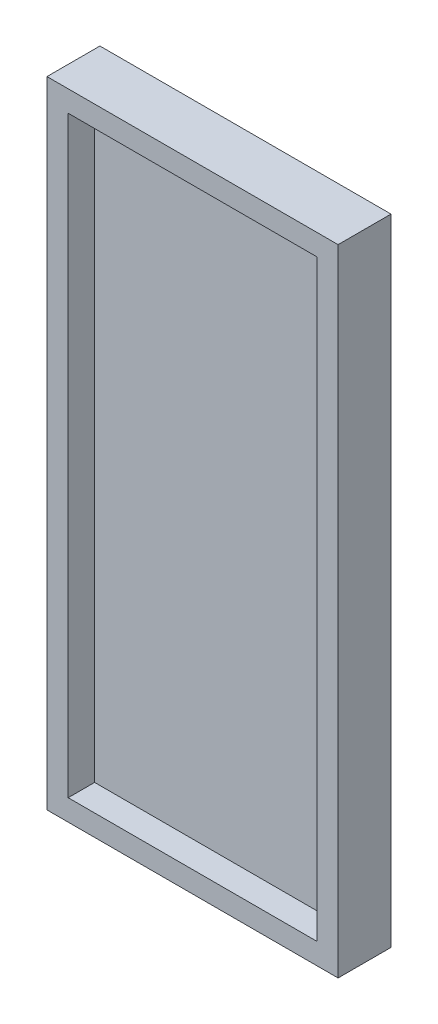
ISO-10303-21;
HEADER;
FILE_DESCRIPTION(('STEP AP214'),'2;1');
FILE_NAME('part.step','',(''),(''),'','','');
FILE_SCHEMA(('AUTOMOTIVE_DESIGN { 1 0 10303 214 1 1 1 1 }'));
ENDSEC;
DATA;
#1=APPLICATION_CONTEXT('core data for automotive mechanical design processes');
#2=APPLICATION_PROTOCOL_DEFINITION('international standard','automotive_design',2000,#1);
#3=PRODUCT_CONTEXT('',#1,'mechanical');
#4=PRODUCT('Part','Part','',(#3));
#5=PRODUCT_RELATED_PRODUCT_CATEGORY('part','',(#4));
#6=PRODUCT_DEFINITION_FORMATION('','',#4);
#7=PRODUCT_DEFINITION_CONTEXT('part definition',#1,'design');
#8=PRODUCT_DEFINITION('design','',#6,#7);
#9=PRODUCT_DEFINITION_SHAPE('','',#8);
#10=(LENGTH_UNIT() NAMED_UNIT(*) SI_UNIT(.MILLI.,.METRE.));
#11=(NAMED_UNIT(*) PLANE_ANGLE_UNIT() SI_UNIT($,.RADIAN.));
#12=(NAMED_UNIT(*) SI_UNIT($,.STERADIAN.) SOLID_ANGLE_UNIT());
#13=UNCERTAINTY_MEASURE_WITH_UNIT(LENGTH_MEASURE(1.E-05),#10,'distance_accuracy_value','');
#14=(GEOMETRIC_REPRESENTATION_CONTEXT(3) GLOBAL_UNCERTAINTY_ASSIGNED_CONTEXT((#13)) GLOBAL_UNIT_ASSIGNED_CONTEXT((#10,
#11,#12)) REPRESENTATION_CONTEXT('',''));
#15=CARTESIAN_POINT('',(0.,0.,0.));
#16=DIRECTION('',(0.,0.,1.));
#17=DIRECTION('',(1.,0.,0.));
#18=AXIS2_PLACEMENT_3D('',#15,#16,#17);
#19=CARTESIAN_POINT('',(0.,0.,10.));
#20=DIRECTION('',(0.,1.,0.));
#21=DIRECTION('',(0.,0.,1.));
#22=AXIS2_PLACEMENT_3D('',#19,#20,#21);
#23=PLANE('',#22);
#24=DIRECTION('',(1.,0.,0.));
#25=VECTOR('',#24,1.);
#26=CARTESIAN_POINT('',(0.,0.,0.));
#27=LINE('',#26,#25);
#28=CARTESIAN_POINT('',(-55.,0.,0.));
#29=VERTEX_POINT('',#28);
#30=CARTESIAN_POINT('',(0.,0.,0.));
#31=VERTEX_POINT('',#30);
#32=EDGE_CURVE('E164',#29,#31,#27,.T.);
#33=ORIENTED_EDGE('',*,*,#32,.T.);
#34=DIRECTION('',(0.,0.,-1.));
#35=VECTOR('',#34,1.);
#36=CARTESIAN_POINT('',(0.,0.,10.));
#37=LINE('',#36,#35);
#38=CARTESIAN_POINT('',(0.,0.,10.));
#39=VERTEX_POINT('',#38);
#40=EDGE_CURVE('E11',#39,#31,#37,.T.);
#41=ORIENTED_EDGE('',*,*,#40,.F.);
#42=DIRECTION('',(1.,0.,0.));
#43=VECTOR('',#42,1.);
#44=CARTESIAN_POINT('',(0.,0.,10.));
#45=LINE('',#44,#43);
#46=CARTESIAN_POINT('',(-55.,0.,10.));
#47=VERTEX_POINT('',#46);
#48=EDGE_CURVE('E170',#47,#39,#45,.T.);
#49=ORIENTED_EDGE('',*,*,#48,.F.);
#50=DIRECTION('',(0.,0.,-1.));
#51=VECTOR('',#50,1.);
#52=CARTESIAN_POINT('',(-55.,0.,10.));
#53=LINE('',#52,#51);
#54=EDGE_CURVE('E180',#47,#29,#53,.T.);
#55=ORIENTED_EDGE('',*,*,#54,.T.);
#56=EDGE_LOOP('',(#33,#41,#49,#55));
#57=FACE_BOUND('',#56,.T.);
#58=ADVANCED_FACE('F45',(#57),#23,.F.);
#59=CARTESIAN_POINT('',(0.,0.,10.));
#60=DIRECTION('',(-1.,0.,0.));
#61=DIRECTION('',(0.,0.,1.));
#62=AXIS2_PLACEMENT_3D('',#59,#60,#61);
#63=PLANE('',#62);
#64=DIRECTION('',(0.,1.,0.));
#65=VECTOR('',#64,1.);
#66=CARTESIAN_POINT('',(0.,0.,0.));
#67=LINE('',#66,#65);
#68=CARTESIAN_POINT('',(0.,120.,0.));
#69=VERTEX_POINT('',#68);
#70=EDGE_CURVE('E184',#31,#69,#67,.T.);
#71=ORIENTED_EDGE('',*,*,#70,.T.);
#72=DIRECTION('',(0.,0.,-1.));
#73=VECTOR('',#72,1.);
#74=CARTESIAN_POINT('',(0.,120.,10.));
#75=LINE('',#74,#73);
#76=CARTESIAN_POINT('',(0.,120.,10.));
#77=VERTEX_POINT('',#76);
#78=EDGE_CURVE('E53',#77,#69,#75,.T.);
#79=ORIENTED_EDGE('',*,*,#78,.F.);
#80=DIRECTION('',(0.,1.,0.));
#81=VECTOR('',#80,1.);
#82=CARTESIAN_POINT('',(0.,0.,10.));
#83=LINE('',#82,#81);
#84=EDGE_CURVE('E97',#39,#77,#83,.T.);
#85=ORIENTED_EDGE('',*,*,#84,.F.);
#86=ORIENTED_EDGE('',*,*,#40,.T.);
#87=EDGE_LOOP('',(#71,#79,#85,#86));
#88=FACE_BOUND('',#87,.T.);
#89=ADVANCED_FACE('F220',(#88),#63,.F.);
#90=CARTESIAN_POINT('',(0.,120.,10.));
#91=DIRECTION('',(0.,-1.,0.));
#92=DIRECTION('',(0.,0.,-1.));
#93=AXIS2_PLACEMENT_3D('',#90,#91,#92);
#94=PLANE('',#93);
#95=DIRECTION('',(-1.,0.,0.));
#96=VECTOR('',#95,1.);
#97=CARTESIAN_POINT('',(0.,120.,0.));
#98=LINE('',#97,#96);
#99=CARTESIAN_POINT('',(-55.,120.,0.));
#100=VERTEX_POINT('',#99);
#101=EDGE_CURVE('E187',#69,#100,#98,.T.);
#102=ORIENTED_EDGE('',*,*,#101,.T.);
#103=DIRECTION('',(0.,0.,-1.));
#104=VECTOR('',#103,1.);
#105=CARTESIAN_POINT('',(-55.,120.,10.));
#106=LINE('',#105,#104);
#107=CARTESIAN_POINT('',(-55.,120.,10.));
#108=VERTEX_POINT('',#107);
#109=EDGE_CURVE('E194',#108,#100,#106,.T.);
#110=ORIENTED_EDGE('',*,*,#109,.F.);
#111=DIRECTION('',(-1.,0.,0.));
#112=VECTOR('',#111,1.);
#113=CARTESIAN_POINT('',(0.,120.,10.));
#114=LINE('',#113,#112);
#115=EDGE_CURVE('E175',#77,#108,#114,.T.);
#116=ORIENTED_EDGE('',*,*,#115,.F.);
#117=ORIENTED_EDGE('',*,*,#78,.T.);
#118=EDGE_LOOP('',(#102,#110,#116,#117));
#119=FACE_BOUND('',#118,.T.);
#120=ADVANCED_FACE('F201',(#119),#94,.F.);
#121=CARTESIAN_POINT('',(-55.,0.,10.));
#122=DIRECTION('',(1.,0.,0.));
#123=DIRECTION('',(0.,0.,-1.));
#124=AXIS2_PLACEMENT_3D('',#121,#122,#123);
#125=PLANE('',#124);
#126=DIRECTION('',(0.,-1.,0.));
#127=VECTOR('',#126,1.);
#128=CARTESIAN_POINT('',(-55.,0.,0.));
#129=LINE('',#128,#127);
#130=EDGE_CURVE('E90',#100,#29,#129,.T.);
#131=ORIENTED_EDGE('',*,*,#130,.T.);
#132=ORIENTED_EDGE('',*,*,#54,.F.);
#133=DIRECTION('',(0.,-1.,0.));
#134=VECTOR('',#133,1.);
#135=CARTESIAN_POINT('',(-55.,0.,10.));
#136=LINE('',#135,#134);
#137=EDGE_CURVE('E69',#108,#47,#136,.T.);
#138=ORIENTED_EDGE('',*,*,#137,.F.);
#139=ORIENTED_EDGE('',*,*,#109,.T.);
#140=EDGE_LOOP('',(#131,#132,#138,#139));
#141=FACE_BOUND('',#140,.T.);
#142=ADVANCED_FACE('F209',(#141),#125,.F.);
#143=CARTESIAN_POINT('',(0.,0.,10.));
#144=DIRECTION('',(0.,0.,-1.));
#145=DIRECTION('',(-1.,0.,0.));
#146=AXIS2_PLACEMENT_3D('',#143,#144,#145);
#147=PLANE('',#146);
#148=DIRECTION('',(1.,0.,0.));
#149=VECTOR('',#148,1.);
#150=CARTESIAN_POINT('',(-51.,4.,10.));
#151=LINE('',#150,#149);
#152=CARTESIAN_POINT('',(-51.,4.,10.));
#153=VERTEX_POINT('',#152);
#154=CARTESIAN_POINT('',(-4.,4.,10.));
#155=VERTEX_POINT('',#154);
#156=EDGE_CURVE('E155',#153,#155,#151,.T.);
#157=ORIENTED_EDGE('',*,*,#156,.F.);
#158=DIRECTION('',(0.,-1.,0.));
#159=VECTOR('',#158,1.);
#160=CARTESIAN_POINT('',(-51.,116.,10.));
#161=LINE('',#160,#159);
#162=CARTESIAN_POINT('',(-51.,116.,10.));
#163=VERTEX_POINT('',#162);
#164=EDGE_CURVE('E60',#163,#153,#161,.T.);
#165=ORIENTED_EDGE('',*,*,#164,.F.);
#166=DIRECTION('',(-1.,0.,0.));
#167=VECTOR('',#166,1.);
#168=CARTESIAN_POINT('',(-4.,116.,10.));
#169=LINE('',#168,#167);
#170=CARTESIAN_POINT('',(-4.,116.,10.));
#171=VERTEX_POINT('',#170);
#172=EDGE_CURVE('E142',#171,#163,#169,.T.);
#173=ORIENTED_EDGE('',*,*,#172,.F.);
#174=DIRECTION('',(0.,1.,0.));
#175=VECTOR('',#174,1.);
#176=CARTESIAN_POINT('',(-4.,4.,10.));
#177=LINE('',#176,#175);
#178=EDGE_CURVE('E146',#155,#171,#177,.T.);
#179=ORIENTED_EDGE('',*,*,#178,.F.);
#180=EDGE_LOOP('',(#157,#165,#173,#179));
#181=FACE_BOUND('',#180,.T.);
#182=ORIENTED_EDGE('',*,*,#48,.T.);
#183=ORIENTED_EDGE('',*,*,#84,.T.);
#184=ORIENTED_EDGE('',*,*,#115,.T.);
#185=ORIENTED_EDGE('',*,*,#137,.T.);
#186=EDGE_LOOP('',(#182,#183,#184,#185));
#187=FACE_BOUND('',#186,.T.);
#188=ADVANCED_FACE('F211',(#181,#187),#147,.F.);
#189=CARTESIAN_POINT('',(0.,0.,0.));
#190=DIRECTION('',(0.,0.,-1.));
#191=DIRECTION('',(-1.,0.,0.));
#192=AXIS2_PLACEMENT_3D('',#189,#190,#191);
#193=PLANE('',#192);
#194=ORIENTED_EDGE('',*,*,#32,.F.);
#195=ORIENTED_EDGE('',*,*,#130,.F.);
#196=ORIENTED_EDGE('',*,*,#101,.F.);
#197=ORIENTED_EDGE('',*,*,#70,.F.);
#198=EDGE_LOOP('',(#194,#195,#196,#197));
#199=FACE_BOUND('',#198,.T.);
#200=ADVANCED_FACE('F205',(#199),#193,.T.);
#201=CARTESIAN_POINT('',(-51.,116.,5.));
#202=DIRECTION('',(-1.,0.,0.));
#203=DIRECTION('',(0.,0.,1.));
#204=AXIS2_PLACEMENT_3D('',#201,#202,#203);
#205=PLANE('',#204);
#206=ORIENTED_EDGE('',*,*,#164,.T.);
#207=DIRECTION('',(0.,0.,1.));
#208=VECTOR('',#207,1.);
#209=CARTESIAN_POINT('',(-51.,4.,5.));
#210=LINE('',#209,#208);
#211=CARTESIAN_POINT('',(-51.,4.,5.));
#212=VERTEX_POINT('',#211);
#213=EDGE_CURVE('E117',#212,#153,#210,.T.);
#214=ORIENTED_EDGE('',*,*,#213,.F.);
#215=DIRECTION('',(0.,-1.,0.));
#216=VECTOR('',#215,1.);
#217=CARTESIAN_POINT('',(-51.,116.,5.));
#218=LINE('',#217,#216);
#219=CARTESIAN_POINT('',(-51.,116.,5.));
#220=VERTEX_POINT('',#219);
#221=EDGE_CURVE('E121',#220,#212,#218,.T.);
#222=ORIENTED_EDGE('',*,*,#221,.F.);
#223=DIRECTION('',(0.,0.,1.));
#224=VECTOR('',#223,1.);
#225=CARTESIAN_POINT('',(-51.,116.,5.));
#226=LINE('',#225,#224);
#227=EDGE_CURVE('E161',#220,#163,#226,.T.);
#228=ORIENTED_EDGE('',*,*,#227,.T.);
#229=EDGE_LOOP('',(#206,#214,#222,#228));
#230=FACE_BOUND('',#229,.T.);
#231=ADVANCED_FACE('F119',(#230),#205,.F.);
#232=CARTESIAN_POINT('',(-4.,116.,5.));
#233=DIRECTION('',(0.,1.,0.));
#234=DIRECTION('',(0.,0.,1.));
#235=AXIS2_PLACEMENT_3D('',#232,#233,#234);
#236=PLANE('',#235);
#237=ORIENTED_EDGE('',*,*,#172,.T.);
#238=ORIENTED_EDGE('',*,*,#227,.F.);
#239=DIRECTION('',(-1.,0.,0.));
#240=VECTOR('',#239,1.);
#241=CARTESIAN_POINT('',(-4.,116.,5.));
#242=LINE('',#241,#240);
#243=CARTESIAN_POINT('',(-4.,116.,5.));
#244=VERTEX_POINT('',#243);
#245=EDGE_CURVE('E128',#244,#220,#242,.T.);
#246=ORIENTED_EDGE('',*,*,#245,.F.);
#247=DIRECTION('',(0.,0.,1.));
#248=VECTOR('',#247,1.);
#249=CARTESIAN_POINT('',(-4.,116.,5.));
#250=LINE('',#249,#248);
#251=EDGE_CURVE('E165',#244,#171,#250,.T.);
#252=ORIENTED_EDGE('',*,*,#251,.T.);
#253=EDGE_LOOP('',(#237,#238,#246,#252));
#254=FACE_BOUND('',#253,.T.);
#255=ADVANCED_FACE('F260',(#254),#236,.F.);
#256=CARTESIAN_POINT('',(-4.,4.,5.));
#257=DIRECTION('',(1.,0.,0.));
#258=DIRECTION('',(0.,0.,-1.));
#259=AXIS2_PLACEMENT_3D('',#256,#257,#258);
#260=PLANE('',#259);
#261=ORIENTED_EDGE('',*,*,#178,.T.);
#262=ORIENTED_EDGE('',*,*,#251,.F.);
#263=DIRECTION('',(0.,1.,0.));
#264=VECTOR('',#263,1.);
#265=CARTESIAN_POINT('',(-4.,4.,5.));
#266=LINE('',#265,#264);
#267=CARTESIAN_POINT('',(-4.,4.,5.));
#268=VERTEX_POINT('',#267);
#269=EDGE_CURVE('E137',#268,#244,#266,.T.);
#270=ORIENTED_EDGE('',*,*,#269,.F.);
#271=DIRECTION('',(0.,0.,1.));
#272=VECTOR('',#271,1.);
#273=CARTESIAN_POINT('',(-4.,4.,5.));
#274=LINE('',#273,#272);
#275=EDGE_CURVE('E127',#268,#155,#274,.T.);
#276=ORIENTED_EDGE('',*,*,#275,.T.);
#277=EDGE_LOOP('',(#261,#262,#270,#276));
#278=FACE_BOUND('',#277,.T.);
#279=ADVANCED_FACE('F269',(#278),#260,.F.);
#280=CARTESIAN_POINT('',(-51.,4.,5.));
#281=DIRECTION('',(0.,-1.,0.));
#282=DIRECTION('',(0.,0.,-1.));
#283=AXIS2_PLACEMENT_3D('',#280,#281,#282);
#284=PLANE('',#283);
#285=ORIENTED_EDGE('',*,*,#156,.T.);
#286=ORIENTED_EDGE('',*,*,#275,.F.);
#287=DIRECTION('',(1.,0.,0.));
#288=VECTOR('',#287,1.);
#289=CARTESIAN_POINT('',(-51.,4.,5.));
#290=LINE('',#289,#288);
#291=EDGE_CURVE('E131',#212,#268,#290,.T.);
#292=ORIENTED_EDGE('',*,*,#291,.F.);
#293=ORIENTED_EDGE('',*,*,#213,.T.);
#294=EDGE_LOOP('',(#285,#286,#292,#293));
#295=FACE_BOUND('',#294,.T.);
#296=ADVANCED_FACE('F132',(#295),#284,.F.);
#297=CARTESIAN_POINT('',(0.,0.,5.));
#298=DIRECTION('',(0.,0.,1.));
#299=DIRECTION('',(1.,0.,0.));
#300=AXIS2_PLACEMENT_3D('',#297,#298,#299);
#301=PLANE('',#300);
#302=ORIENTED_EDGE('',*,*,#221,.T.);
#303=ORIENTED_EDGE('',*,*,#291,.T.);
#304=ORIENTED_EDGE('',*,*,#269,.T.);
#305=ORIENTED_EDGE('',*,*,#245,.T.);
#306=EDGE_LOOP('',(#302,#303,#304,#305));
#307=FACE_BOUND('',#306,.T.);
#308=ADVANCED_FACE('F139',(#307),#301,.T.);
#309=CLOSED_SHELL('',(#58,#89,#120,#142,#188,#200,#231,#255,#279,#296,#308));
#310=MANIFOLD_SOLID_BREP('B2',#309);
#311=ADVANCED_BREP_SHAPE_REPRESENTATION('',(#18,#310),#14);
#312=SHAPE_DEFINITION_REPRESENTATION(#9,#311);
ENDSEC;
END-ISO-10303-21;
